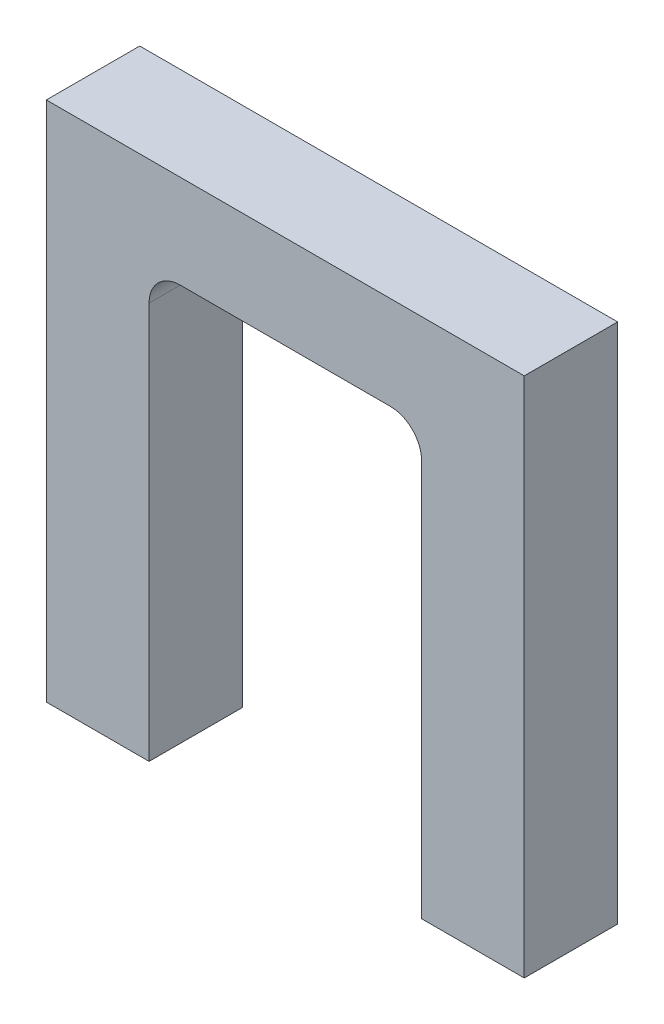
ISO-10303-21;
HEADER;
FILE_DESCRIPTION(('STEP AP214'),'2;1');
FILE_NAME('part.step','',(''),(''),'','','');
FILE_SCHEMA(('AUTOMOTIVE_DESIGN { 1 0 10303 214 1 1 1 1 }'));
ENDSEC;
DATA;
#1=APPLICATION_CONTEXT('core data for automotive mechanical design processes');
#2=APPLICATION_PROTOCOL_DEFINITION('international standard','automotive_design',2000,#1);
#3=PRODUCT_CONTEXT('',#1,'mechanical');
#4=PRODUCT('Part','Part','',(#3));
#5=PRODUCT_RELATED_PRODUCT_CATEGORY('part','',(#4));
#6=PRODUCT_DEFINITION_FORMATION('','',#4);
#7=PRODUCT_DEFINITION_CONTEXT('part definition',#1,'design');
#8=PRODUCT_DEFINITION('design','',#6,#7);
#9=PRODUCT_DEFINITION_SHAPE('','',#8);
#10=(LENGTH_UNIT() NAMED_UNIT(*) SI_UNIT(.MILLI.,.METRE.));
#11=(NAMED_UNIT(*) PLANE_ANGLE_UNIT() SI_UNIT($,.RADIAN.));
#12=(NAMED_UNIT(*) SI_UNIT($,.STERADIAN.) SOLID_ANGLE_UNIT());
#13=UNCERTAINTY_MEASURE_WITH_UNIT(LENGTH_MEASURE(1.E-05),#10,'distance_accuracy_value','');
#14=(GEOMETRIC_REPRESENTATION_CONTEXT(3) GLOBAL_UNCERTAINTY_ASSIGNED_CONTEXT((#13)) GLOBAL_UNIT_ASSIGNED_CONTEXT((#10,
#11,#12)) REPRESENTATION_CONTEXT('',''));
#15=CARTESIAN_POINT('',(0.,0.,0.));
#16=DIRECTION('',(0.,0.,1.));
#17=DIRECTION('',(1.,0.,0.));
#18=AXIS2_PLACEMENT_3D('',#15,#16,#17);
#19=CARTESIAN_POINT('',(0.,20.40625,3.));
#20=DIRECTION('',(0.,1.,0.));
#21=DIRECTION('',(0.,0.,1.));
#22=AXIS2_PLACEMENT_3D('',#19,#20,#21);
#23=PLANE('',#22);
#24=DIRECTION('',(1.,0.,0.));
#25=VECTOR('',#24,1.);
#26=CARTESIAN_POINT('',(0.,20.40625,-3.));
#27=LINE('',#26,#25);
#28=CARTESIAN_POINT('',(-6.75,20.40625,-3.));
#29=VERTEX_POINT('',#28);
#30=CARTESIAN_POINT('',(6.75,20.40625,-3.));
#31=VERTEX_POINT('',#30);
#32=EDGE_CURVE('E145',#29,#31,#27,.T.);
#33=ORIENTED_EDGE('',*,*,#32,.T.);
#34=DIRECTION('',(0.,0.,-1.));
#35=VECTOR('',#34,1.);
#36=CARTESIAN_POINT('',(6.75,20.40625,3.));
#37=LINE('',#36,#35);
#38=CARTESIAN_POINT('',(6.75,20.40625,3.));
#39=VERTEX_POINT('',#38);
#40=EDGE_CURVE('E11',#39,#31,#37,.T.);
#41=ORIENTED_EDGE('',*,*,#40,.F.);
#42=DIRECTION('',(1.,0.,0.));
#43=VECTOR('',#42,1.);
#44=CARTESIAN_POINT('',(0.,20.40625,3.));
#45=LINE('',#44,#43);
#46=CARTESIAN_POINT('',(-6.75,20.40625,3.));
#47=VERTEX_POINT('',#46);
#48=EDGE_CURVE('E169',#47,#39,#45,.T.);
#49=ORIENTED_EDGE('',*,*,#48,.F.);
#50=DIRECTION('',(0.,0.,-1.));
#51=VECTOR('',#50,1.);
#52=CARTESIAN_POINT('',(-6.75,20.40625,3.));
#53=LINE('',#52,#51);
#54=EDGE_CURVE('E52',#47,#29,#53,.T.);
#55=ORIENTED_EDGE('',*,*,#54,.T.);
#56=EDGE_LOOP('',(#33,#41,#49,#55));
#57=FACE_BOUND('',#56,.T.);
#58=ADVANCED_FACE('F36',(#57),#23,.F.);
#59=CARTESIAN_POINT('',(6.75,18.40625,3.));
#60=DIRECTION('',(0.,0.,-1.));
#61=DIRECTION('',(-1.,0.,0.));
#62=AXIS2_PLACEMENT_3D('',#59,#60,#61);
#63=CYLINDRICAL_SURFACE('',#62,2.);
#64=CARTESIAN_POINT('',(6.75,18.40625,-3.));
#65=DIRECTION('',(0.,0.,1.));
#66=DIRECTION('',(1.,0.,0.));
#67=AXIS2_PLACEMENT_3D('',#64,#65,#66);
#68=CIRCLE('',#67,2.);
#69=CARTESIAN_POINT('',(8.75,18.40625,-3.));
#70=VERTEX_POINT('',#69);
#71=EDGE_CURVE('E147',#31,#70,#68,.F.);
#72=ORIENTED_EDGE('',*,*,#71,.T.);
#73=DIRECTION('',(0.,0.,-1.));
#74=VECTOR('',#73,1.);
#75=CARTESIAN_POINT('',(8.75,18.40625,3.));
#76=LINE('',#75,#74);
#77=CARTESIAN_POINT('',(8.75,18.40625,3.));
#78=VERTEX_POINT('',#77);
#79=EDGE_CURVE('E44',#78,#70,#76,.T.);
#80=ORIENTED_EDGE('',*,*,#79,.F.);
#81=CARTESIAN_POINT('',(6.75,18.40625,3.));
#82=DIRECTION('',(0.,0.,1.));
#83=DIRECTION('',(1.,0.,0.));
#84=AXIS2_PLACEMENT_3D('',#81,#82,#83);
#85=CIRCLE('',#84,2.);
#86=EDGE_CURVE('E96',#39,#78,#85,.F.);
#87=ORIENTED_EDGE('',*,*,#86,.F.);
#88=ORIENTED_EDGE('',*,*,#40,.T.);
#89=EDGE_LOOP('',(#72,#80,#87,#88));
#90=FACE_BOUND('',#89,.T.);
#91=ADVANCED_FACE('F224',(#90),#63,.F.);
#92=CARTESIAN_POINT('',(8.75,0.,3.));
#93=DIRECTION('',(1.,0.,0.));
#94=DIRECTION('',(0.,1.,0.));
#95=AXIS2_PLACEMENT_3D('',#92,#93,#94);
#96=PLANE('',#95);
#97=DIRECTION('',(0.,-1.,0.));
#98=VECTOR('',#97,1.);
#99=CARTESIAN_POINT('',(8.75,0.,-3.));
#100=LINE('',#99,#98);
#101=CARTESIAN_POINT('',(8.75000000000001,-7.09374999999998,-3.));
#102=VERTEX_POINT('',#101);
#103=EDGE_CURVE('E150',#70,#102,#100,.T.);
#104=ORIENTED_EDGE('',*,*,#103,.T.);
#105=DIRECTION('',(0.,0.,-1.));
#106=VECTOR('',#105,1.);
#107=CARTESIAN_POINT('',(8.75000000000001,-7.09374999999998,3.));
#108=LINE('',#107,#106);
#109=CARTESIAN_POINT('',(8.75000000000001,-7.09374999999998,3.));
#110=VERTEX_POINT('',#109);
#111=EDGE_CURVE('E180',#110,#102,#108,.T.);
#112=ORIENTED_EDGE('',*,*,#111,.F.);
#113=DIRECTION('',(0.,-1.,0.));
#114=VECTOR('',#113,1.);
#115=CARTESIAN_POINT('',(8.75,0.,3.));
#116=LINE('',#115,#114);
#117=EDGE_CURVE('E188',#78,#110,#116,.T.);
#118=ORIENTED_EDGE('',*,*,#117,.F.);
#119=ORIENTED_EDGE('',*,*,#79,.T.);
#120=EDGE_LOOP('',(#104,#112,#118,#119));
#121=FACE_BOUND('',#120,.T.);
#122=ADVANCED_FACE('F186',(#121),#96,.F.);
#123=CARTESIAN_POINT('',(0.,-7.09374999999998,3.));
#124=DIRECTION('',(0.,1.,0.));
#125=DIRECTION('',(-1.,0.,0.));
#126=AXIS2_PLACEMENT_3D('',#123,#124,#125);
#127=PLANE('',#126);
#128=CARTESIAN_POINT('',(12.05,-7.09374999999998,0.));
#129=DIRECTION('',(0.,-1.,0.));
#130=DIRECTION('',(-1.,0.,0.));
#131=AXIS2_PLACEMENT_3D('',#128,#129,#130);
#132=CIRCLE('',#131,1.5);
#133=CARTESIAN_POINT('',(10.55,-7.09374999999998,0.));
#134=VERTEX_POINT('',#133);
#135=EDGE_CURVE('E232',#134,#134,#132,.T.);
#136=ORIENTED_EDGE('',*,*,#135,.F.);
#137=EDGE_LOOP('',(#136));
#138=FACE_BOUND('',#137,.T.);
#139=DIRECTION('',(1.,0.,0.));
#140=VECTOR('',#139,1.);
#141=CARTESIAN_POINT('',(0.,-7.09374999999998,-3.));
#142=LINE('',#141,#140);
#143=CARTESIAN_POINT('',(15.35,-7.09374999999998,-3.));
#144=VERTEX_POINT('',#143);
#145=EDGE_CURVE('E152',#102,#144,#142,.T.);
#146=ORIENTED_EDGE('',*,*,#145,.T.);
#147=DIRECTION('',(0.,0.,-1.));
#148=VECTOR('',#147,1.);
#149=CARTESIAN_POINT('',(15.35,-7.09374999999998,3.));
#150=LINE('',#149,#148);
#151=CARTESIAN_POINT('',(15.35,-7.09374999999998,3.));
#152=VERTEX_POINT('',#151);
#153=EDGE_CURVE('E177',#152,#144,#150,.T.);
#154=ORIENTED_EDGE('',*,*,#153,.F.);
#155=DIRECTION('',(1.,0.,0.));
#156=VECTOR('',#155,1.);
#157=CARTESIAN_POINT('',(0.,-7.09374999999998,3.));
#158=LINE('',#157,#156);
#159=EDGE_CURVE('E204',#110,#152,#158,.T.);
#160=ORIENTED_EDGE('',*,*,#159,.F.);
#161=ORIENTED_EDGE('',*,*,#111,.T.);
#162=EDGE_LOOP('',(#146,#154,#160,#161));
#163=FACE_BOUND('',#162,.T.);
#164=ADVANCED_FACE('F195',(#138,#163),#127,.F.);
#165=CARTESIAN_POINT('',(15.35,0.,3.));
#166=DIRECTION('',(-1.,0.,0.));
#167=DIRECTION('',(0.,-1.,0.));
#168=AXIS2_PLACEMENT_3D('',#165,#166,#167);
#169=PLANE('',#168);
#170=DIRECTION('',(0.,1.,0.));
#171=VECTOR('',#170,1.);
#172=CARTESIAN_POINT('',(15.35,0.,-3.));
#173=LINE('',#172,#171);
#174=CARTESIAN_POINT('',(15.35,26.40625,-3.));
#175=VERTEX_POINT('',#174);
#176=EDGE_CURVE('E154',#144,#175,#173,.T.);
#177=ORIENTED_EDGE('',*,*,#176,.T.);
#178=DIRECTION('',(0.,0.,-1.));
#179=VECTOR('',#178,1.);
#180=CARTESIAN_POINT('',(15.35,26.40625,3.));
#181=LINE('',#180,#179);
#182=CARTESIAN_POINT('',(15.35,26.40625,3.));
#183=VERTEX_POINT('',#182);
#184=EDGE_CURVE('E175',#183,#175,#181,.T.);
#185=ORIENTED_EDGE('',*,*,#184,.F.);
#186=DIRECTION('',(0.,1.,0.));
#187=VECTOR('',#186,1.);
#188=CARTESIAN_POINT('',(15.35,0.,3.));
#189=LINE('',#188,#187);
#190=EDGE_CURVE('E201',#152,#183,#189,.T.);
#191=ORIENTED_EDGE('',*,*,#190,.F.);
#192=ORIENTED_EDGE('',*,*,#153,.T.);
#193=EDGE_LOOP('',(#177,#185,#191,#192));
#194=FACE_BOUND('',#193,.T.);
#195=ADVANCED_FACE('F199',(#194),#169,.F.);
#196=CARTESIAN_POINT('',(0.,26.40625,3.));
#197=DIRECTION('',(0.,1.,0.));
#198=DIRECTION('',(-1.,0.,0.));
#199=AXIS2_PLACEMENT_3D('',#196,#197,#198);
#200=PLANE('',#199);
#201=DIRECTION('',(1.,0.,0.));
#202=VECTOR('',#201,1.);
#203=CARTESIAN_POINT('',(0.,26.40625,-3.));
#204=LINE('',#203,#202);
#205=CARTESIAN_POINT('',(-15.35,26.40625,-3.));
#206=VERTEX_POINT('',#205);
#207=EDGE_CURVE('E157',#206,#175,#204,.T.);
#208=ORIENTED_EDGE('',*,*,#207,.F.);
#209=DIRECTION('',(0.,0.,-1.));
#210=VECTOR('',#209,1.);
#211=CARTESIAN_POINT('',(-15.35,26.40625,3.));
#212=LINE('',#211,#210);
#213=CARTESIAN_POINT('',(-15.35,26.40625,3.));
#214=VERTEX_POINT('',#213);
#215=EDGE_CURVE('E173',#214,#206,#212,.T.);
#216=ORIENTED_EDGE('',*,*,#215,.F.);
#217=DIRECTION('',(1.,0.,0.));
#218=VECTOR('',#217,1.);
#219=CARTESIAN_POINT('',(0.,26.40625,3.));
#220=LINE('',#219,#218);
#221=EDGE_CURVE('E203',#214,#183,#220,.T.);
#222=ORIENTED_EDGE('',*,*,#221,.T.);
#223=ORIENTED_EDGE('',*,*,#184,.T.);
#224=EDGE_LOOP('',(#208,#216,#222,#223));
#225=FACE_BOUND('',#224,.T.);
#226=ADVANCED_FACE('F257',(#225),#200,.T.);
#227=CARTESIAN_POINT('',(-15.35,0.,3.));
#228=DIRECTION('',(-1.,0.,0.));
#229=DIRECTION('',(0.,-1.,0.));
#230=AXIS2_PLACEMENT_3D('',#227,#228,#229);
#231=PLANE('',#230);
#232=DIRECTION('',(0.,1.,0.));
#233=VECTOR('',#232,1.);
#234=CARTESIAN_POINT('',(-15.35,0.,-3.));
#235=LINE('',#234,#233);
#236=CARTESIAN_POINT('',(-15.35,-7.09374999999999,-3.));
#237=VERTEX_POINT('',#236);
#238=EDGE_CURVE('E160',#237,#206,#235,.T.);
#239=ORIENTED_EDGE('',*,*,#238,.F.);
#240=DIRECTION('',(0.,0.,-1.));
#241=VECTOR('',#240,1.);
#242=CARTESIAN_POINT('',(-15.35,-7.09374999999999,3.));
#243=LINE('',#242,#241);
#244=CARTESIAN_POINT('',(-15.35,-7.09374999999999,3.));
#245=VERTEX_POINT('',#244);
#246=EDGE_CURVE('E127',#245,#237,#243,.T.);
#247=ORIENTED_EDGE('',*,*,#246,.F.);
#248=DIRECTION('',(0.,1.,0.));
#249=VECTOR('',#248,1.);
#250=CARTESIAN_POINT('',(-15.35,0.,3.));
#251=LINE('',#250,#249);
#252=EDGE_CURVE('E137',#245,#214,#251,.T.);
#253=ORIENTED_EDGE('',*,*,#252,.T.);
#254=ORIENTED_EDGE('',*,*,#215,.T.);
#255=EDGE_LOOP('',(#239,#247,#253,#254));
#256=FACE_BOUND('',#255,.T.);
#257=ADVANCED_FACE('F211',(#256),#231,.T.);
#258=CARTESIAN_POINT('',(0.,-7.09374999999998,3.));
#259=DIRECTION('',(0.,-1.,0.));
#260=DIRECTION('',(1.,0.,0.));
#261=AXIS2_PLACEMENT_3D('',#258,#259,#260);
#262=PLANE('',#261);
#263=CARTESIAN_POINT('',(-12.05,-7.09374999999999,0.));
#264=DIRECTION('',(0.,-1.,0.));
#265=DIRECTION('',(1.,0.,0.));
#266=AXIS2_PLACEMENT_3D('',#263,#264,#265);
#267=CIRCLE('',#266,1.5);
#268=CARTESIAN_POINT('',(-10.55,-7.09374999999999,0.));
#269=VERTEX_POINT('',#268);
#270=EDGE_CURVE('E238',#269,#269,#267,.T.);
#271=ORIENTED_EDGE('',*,*,#270,.F.);
#272=EDGE_LOOP('',(#271));
#273=FACE_BOUND('',#272,.T.);
#274=DIRECTION('',(-1.,0.,0.));
#275=VECTOR('',#274,1.);
#276=CARTESIAN_POINT('',(0.,-7.09374999999998,-3.));
#277=LINE('',#276,#275);
#278=CARTESIAN_POINT('',(-8.75,-7.09374999999999,-3.));
#279=VERTEX_POINT('',#278);
#280=EDGE_CURVE('E123',#279,#237,#277,.T.);
#281=ORIENTED_EDGE('',*,*,#280,.F.);
#282=DIRECTION('',(0.,0.,-1.));
#283=VECTOR('',#282,1.);
#284=CARTESIAN_POINT('',(-8.75,-7.09374999999999,3.));
#285=LINE('',#284,#283);
#286=CARTESIAN_POINT('',(-8.75,-7.09374999999999,3.));
#287=VERTEX_POINT('',#286);
#288=EDGE_CURVE('E118',#287,#279,#285,.T.);
#289=ORIENTED_EDGE('',*,*,#288,.F.);
#290=DIRECTION('',(-1.,0.,0.));
#291=VECTOR('',#290,1.);
#292=CARTESIAN_POINT('',(0.,-7.09374999999998,3.));
#293=LINE('',#292,#291);
#294=EDGE_CURVE('E121',#287,#245,#293,.T.);
#295=ORIENTED_EDGE('',*,*,#294,.T.);
#296=ORIENTED_EDGE('',*,*,#246,.T.);
#297=EDGE_LOOP('',(#281,#289,#295,#296));
#298=FACE_BOUND('',#297,.T.);
#299=ADVANCED_FACE('F120',(#273,#298),#262,.T.);
#300=CARTESIAN_POINT('',(-8.75,0.,3.));
#301=DIRECTION('',(1.,0.,0.));
#302=DIRECTION('',(0.,1.,0.));
#303=AXIS2_PLACEMENT_3D('',#300,#301,#302);
#304=PLANE('',#303);
#305=DIRECTION('',(0.,-1.,0.));
#306=VECTOR('',#305,1.);
#307=CARTESIAN_POINT('',(-8.75,0.,-3.));
#308=LINE('',#307,#306);
#309=CARTESIAN_POINT('',(-8.75,18.40625,-3.));
#310=VERTEX_POINT('',#309);
#311=EDGE_CURVE('E164',#310,#279,#308,.T.);
#312=ORIENTED_EDGE('',*,*,#311,.F.);
#313=DIRECTION('',(0.,0.,-1.));
#314=VECTOR('',#313,1.);
#315=CARTESIAN_POINT('',(-8.75,18.40625,3.));
#316=LINE('',#315,#314);
#317=CARTESIAN_POINT('',(-8.75,18.40625,3.));
#318=VERTEX_POINT('',#317);
#319=EDGE_CURVE('E84',#318,#310,#316,.T.);
#320=ORIENTED_EDGE('',*,*,#319,.F.);
#321=DIRECTION('',(0.,-1.,0.));
#322=VECTOR('',#321,1.);
#323=CARTESIAN_POINT('',(-8.75,0.,3.));
#324=LINE('',#323,#322);
#325=EDGE_CURVE('E134',#318,#287,#324,.T.);
#326=ORIENTED_EDGE('',*,*,#325,.T.);
#327=ORIENTED_EDGE('',*,*,#288,.T.);
#328=EDGE_LOOP('',(#312,#320,#326,#327));
#329=FACE_BOUND('',#328,.T.);
#330=ADVANCED_FACE('F139',(#329),#304,.T.);
#331=CARTESIAN_POINT('',(-6.75,18.40625,3.));
#332=DIRECTION('',(0.,0.,-1.));
#333=DIRECTION('',(-1.,0.,0.));
#334=AXIS2_PLACEMENT_3D('',#331,#332,#333);
#335=CYLINDRICAL_SURFACE('',#334,2.);
#336=CARTESIAN_POINT('',(-6.75,18.40625,-3.));
#337=DIRECTION('',(0.,0.,1.));
#338=DIRECTION('',(1.,0.,0.));
#339=AXIS2_PLACEMENT_3D('',#336,#337,#338);
#340=CIRCLE('',#339,2.);
#341=EDGE_CURVE('E166',#29,#310,#340,.T.);
#342=ORIENTED_EDGE('',*,*,#341,.F.);
#343=ORIENTED_EDGE('',*,*,#54,.F.);
#344=CARTESIAN_POINT('',(-6.75,18.40625,3.));
#345=DIRECTION('',(0.,0.,1.));
#346=DIRECTION('',(1.,0.,0.));
#347=AXIS2_PLACEMENT_3D('',#344,#345,#346);
#348=CIRCLE('',#347,2.);
#349=EDGE_CURVE('E140',#47,#318,#348,.T.);
#350=ORIENTED_EDGE('',*,*,#349,.T.);
#351=ORIENTED_EDGE('',*,*,#319,.T.);
#352=EDGE_LOOP('',(#342,#343,#350,#351));
#353=FACE_BOUND('',#352,.T.);
#354=ADVANCED_FACE('F213',(#353),#335,.F.);
#355=CARTESIAN_POINT('',(0.,0.,3.));
#356=DIRECTION('',(0.,0.,1.));
#357=DIRECTION('',(1.,0.,0.));
#358=AXIS2_PLACEMENT_3D('',#355,#356,#357);
#359=PLANE('',#358);
#360=ORIENTED_EDGE('',*,*,#48,.T.);
#361=ORIENTED_EDGE('',*,*,#86,.T.);
#362=ORIENTED_EDGE('',*,*,#117,.T.);
#363=ORIENTED_EDGE('',*,*,#159,.T.);
#364=ORIENTED_EDGE('',*,*,#190,.T.);
#365=ORIENTED_EDGE('',*,*,#221,.F.);
#366=ORIENTED_EDGE('',*,*,#252,.F.);
#367=ORIENTED_EDGE('',*,*,#294,.F.);
#368=ORIENTED_EDGE('',*,*,#325,.F.);
#369=ORIENTED_EDGE('',*,*,#349,.F.);
#370=EDGE_LOOP('',(#360,#361,#362,#363,#364,#365,#366,#367,#368,#369));
#371=FACE_BOUND('',#370,.T.);
#372=ADVANCED_FACE('F132',(#371),#359,.T.);
#373=CARTESIAN_POINT('',(0.,0.,-3.));
#374=DIRECTION('',(0.,0.,1.));
#375=DIRECTION('',(1.,0.,0.));
#376=AXIS2_PLACEMENT_3D('',#373,#374,#375);
#377=PLANE('',#376);
#378=ORIENTED_EDGE('',*,*,#32,.F.);
#379=ORIENTED_EDGE('',*,*,#341,.T.);
#380=ORIENTED_EDGE('',*,*,#311,.T.);
#381=ORIENTED_EDGE('',*,*,#280,.T.);
#382=ORIENTED_EDGE('',*,*,#238,.T.);
#383=ORIENTED_EDGE('',*,*,#207,.T.);
#384=ORIENTED_EDGE('',*,*,#176,.F.);
#385=ORIENTED_EDGE('',*,*,#145,.F.);
#386=ORIENTED_EDGE('',*,*,#103,.F.);
#387=ORIENTED_EDGE('',*,*,#71,.F.);
#388=EDGE_LOOP('',(#378,#379,#380,#381,#382,#383,#384,#385,#386,#387));
#389=FACE_BOUND('',#388,.T.);
#390=ADVANCED_FACE('F191',(#389),#377,.F.);
#391=CARTESIAN_POINT('',(-12.05,4.90625000000001,0.));
#392=DIRECTION('',(0.,-1.,0.));
#393=DIRECTION('',(1.,0.,0.));
#394=AXIS2_PLACEMENT_3D('',#391,#392,#393);
#395=CYLINDRICAL_SURFACE('',#394,1.5);
#396=CARTESIAN_POINT('',(-12.05,4.90625000000001,0.));
#397=DIRECTION('',(0.,-1.,0.));
#398=DIRECTION('',(1.,0.,0.));
#399=AXIS2_PLACEMENT_3D('',#396,#397,#398);
#400=CIRCLE('',#399,1.5);
#401=CARTESIAN_POINT('',(-10.55,4.90625000000001,0.));
#402=VERTEX_POINT('',#401);
#403=EDGE_CURVE('E148',#402,#402,#400,.T.);
#404=ORIENTED_EDGE('',*,*,#403,.F.);
#405=EDGE_LOOP('',(#404));
#406=FACE_BOUND('',#405,.T.);
#407=ORIENTED_EDGE('',*,*,#270,.T.);
#408=EDGE_LOOP('',(#407));
#409=FACE_BOUND('',#408,.T.);
#410=ADVANCED_FACE('F246',(#406,#409),#395,.F.);
#411=CARTESIAN_POINT('',(-12.05,4.90625000000001,0.));
#412=DIRECTION('',(0.,-1.,0.));
#413=DIRECTION('',(1.,0.,0.));
#414=AXIS2_PLACEMENT_3D('',#411,#412,#413);
#415=PLANE('',#414);
#416=ORIENTED_EDGE('',*,*,#403,.T.);
#417=EDGE_LOOP('',(#416));
#418=FACE_BOUND('',#417,.T.);
#419=ADVANCED_FACE('F244',(#418),#415,.T.);
#420=CARTESIAN_POINT('',(12.05,4.90625000000002,0.));
#421=DIRECTION('',(0.,-1.,0.));
#422=DIRECTION('',(1.,0.,0.));
#423=AXIS2_PLACEMENT_3D('',#420,#421,#422);
#424=CYLINDRICAL_SURFACE('',#423,1.5);
#425=CARTESIAN_POINT('',(12.05,4.90625000000002,0.));
#426=DIRECTION('',(0.,-1.,0.));
#427=DIRECTION('',(-1.,0.,0.));
#428=AXIS2_PLACEMENT_3D('',#425,#426,#427);
#429=CIRCLE('',#428,1.5);
#430=CARTESIAN_POINT('',(10.55,4.90625000000002,0.));
#431=VERTEX_POINT('',#430);
#432=EDGE_CURVE('E235',#431,#431,#429,.T.);
#433=ORIENTED_EDGE('',*,*,#432,.F.);
#434=EDGE_LOOP('',(#433));
#435=FACE_BOUND('',#434,.T.);
#436=ORIENTED_EDGE('',*,*,#135,.T.);
#437=EDGE_LOOP('',(#436));
#438=FACE_BOUND('',#437,.T.);
#439=ADVANCED_FACE('F325',(#435,#438),#424,.F.);
#440=CARTESIAN_POINT('',(12.05,4.90625000000002,0.));
#441=DIRECTION('',(0.,1.,0.));
#442=DIRECTION('',(-1.,0.,0.));
#443=AXIS2_PLACEMENT_3D('',#440,#441,#442);
#444=PLANE('',#443);
#445=ORIENTED_EDGE('',*,*,#432,.T.);
#446=EDGE_LOOP('',(#445));
#447=FACE_BOUND('',#446,.T.);
#448=ADVANCED_FACE('F332',(#447),#444,.F.);
#449=CLOSED_SHELL('',(#58,#91,#122,#164,#195,#226,#257,#299,#330,#354,#372,#390,#410,#419,#439,#448));
#450=MANIFOLD_SOLID_BREP('B2',#449);
#451=ADVANCED_BREP_SHAPE_REPRESENTATION('',(#18,#450),#14);
#452=SHAPE_DEFINITION_REPRESENTATION(#9,#451);
ENDSEC;
END-ISO-10303-21;
